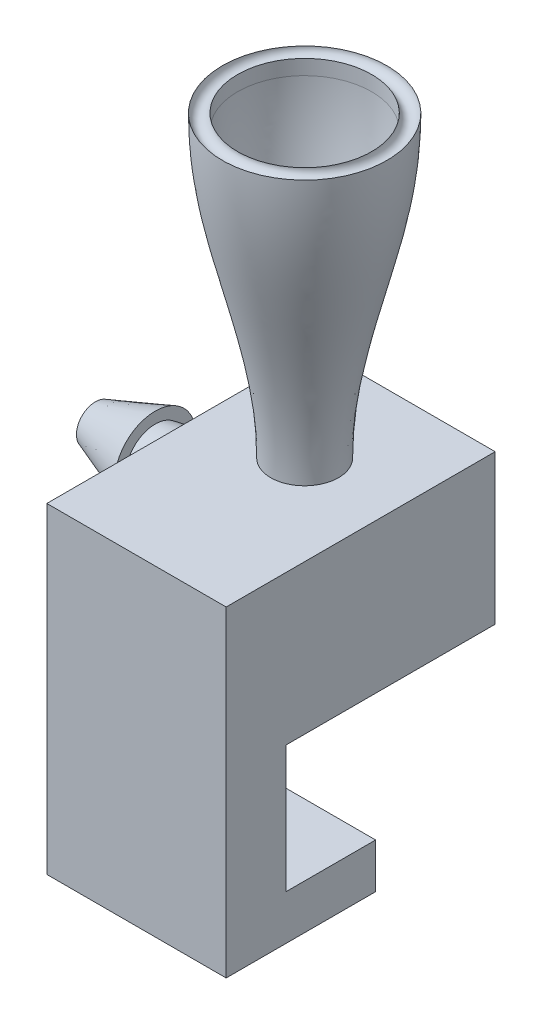
ISO-10303-21;
HEADER;
FILE_DESCRIPTION(('STEP AP214'),'2;1');
FILE_NAME('part.step','',(''),(''),'','','');
FILE_SCHEMA(('AUTOMOTIVE_DESIGN { 1 0 10303 214 1 1 1 1 }'));
ENDSEC;
DATA;
#1=APPLICATION_CONTEXT('core data for automotive mechanical design processes');
#2=APPLICATION_PROTOCOL_DEFINITION('international standard','automotive_design',2000,#1);
#3=PRODUCT_CONTEXT('',#1,'mechanical');
#4=PRODUCT('Part','Part','',(#3));
#5=PRODUCT_RELATED_PRODUCT_CATEGORY('part','',(#4));
#6=PRODUCT_DEFINITION_FORMATION('','',#4);
#7=PRODUCT_DEFINITION_CONTEXT('part definition',#1,'design');
#8=PRODUCT_DEFINITION('design','',#6,#7);
#9=PRODUCT_DEFINITION_SHAPE('','',#8);
#10=(LENGTH_UNIT() NAMED_UNIT(*) SI_UNIT(.MILLI.,.METRE.));
#11=(NAMED_UNIT(*) PLANE_ANGLE_UNIT() SI_UNIT($,.RADIAN.));
#12=(NAMED_UNIT(*) SI_UNIT($,.STERADIAN.) SOLID_ANGLE_UNIT());
#13=UNCERTAINTY_MEASURE_WITH_UNIT(LENGTH_MEASURE(1.E-05),#10,'distance_accuracy_value','');
#14=(GEOMETRIC_REPRESENTATION_CONTEXT(3) GLOBAL_UNCERTAINTY_ASSIGNED_CONTEXT((#13)) GLOBAL_UNIT_ASSIGNED_CONTEXT((#10,
#11,#12)) REPRESENTATION_CONTEXT('',''));
#15=CARTESIAN_POINT('',(0.,0.,0.));
#16=DIRECTION('',(0.,0.,1.));
#17=DIRECTION('',(1.,0.,0.));
#18=AXIS2_PLACEMENT_3D('',#15,#16,#17);
#19=CARTESIAN_POINT('',(0.,0.,14.));
#20=DIRECTION('',(0.,0.,-1.));
#21=DIRECTION('',(-1.,0.,0.));
#22=AXIS2_PLACEMENT_3D('',#19,#20,#21);
#23=PLANE('',#22);
#24=DIRECTION('',(0.,-1.,0.));
#25=VECTOR('',#24,1.);
#26=CARTESIAN_POINT('',(-2.,-13.5,14.));
#27=LINE('',#26,#25);
#28=CARTESIAN_POINT('',(-2.,-6.5,14.));
#29=VERTEX_POINT('',#28);
#30=CARTESIAN_POINT('',(-2.,-12.,14.));
#31=VERTEX_POINT('',#30);
#32=EDGE_CURVE('E142',#29,#31,#27,.T.);
#33=ORIENTED_EDGE('',*,*,#32,.F.);
#34=CARTESIAN_POINT('',(-0.499999999999999,-6.5,14.));
#35=DIRECTION('',(0.,0.,-1.));
#36=DIRECTION('',(-1.,0.,0.));
#37=AXIS2_PLACEMENT_3D('',#34,#35,#36);
#38=CIRCLE('',#37,1.5);
#39=CARTESIAN_POINT('',(-0.499999999999999,-5.00000000000001,14.));
#40=VERTEX_POINT('',#39);
#41=EDGE_CURVE('E185',#29,#40,#38,.T.);
#42=ORIENTED_EDGE('',*,*,#41,.T.);
#43=DIRECTION('',(-1.,0.,0.));
#44=VECTOR('',#43,1.);
#45=CARTESIAN_POINT('',(6.00000000000001,-5.,14.));
#46=LINE('',#45,#44);
#47=CARTESIAN_POINT('',(6.00000000000001,-5.,14.));
#48=VERTEX_POINT('',#47);
#49=EDGE_CURVE('E201',#48,#40,#46,.T.);
#50=ORIENTED_EDGE('',*,*,#49,.F.);
#51=DIRECTION('',(0.,1.,0.));
#52=VECTOR('',#51,1.);
#53=CARTESIAN_POINT('',(6.00000000000001,-5.,14.));
#54=LINE('',#53,#52);
#55=CARTESIAN_POINT('',(6.00000000000001,-13.5,14.));
#56=VERTEX_POINT('',#55);
#57=EDGE_CURVE('E204',#56,#48,#54,.T.);
#58=ORIENTED_EDGE('',*,*,#57,.F.);
#59=DIRECTION('',(1.,0.,0.));
#60=VECTOR('',#59,1.);
#61=CARTESIAN_POINT('',(-6.,-13.5,14.));
#62=LINE('',#61,#60);
#63=CARTESIAN_POINT('',(-0.499999999999999,-13.5,14.));
#64=VERTEX_POINT('',#63);
#65=EDGE_CURVE('E131',#64,#56,#62,.T.);
#66=ORIENTED_EDGE('',*,*,#65,.F.);
#67=CARTESIAN_POINT('',(-0.499999999999998,-12.,14.));
#68=DIRECTION('',(0.,0.,-1.));
#69=DIRECTION('',(-1.,0.,0.));
#70=AXIS2_PLACEMENT_3D('',#67,#68,#69);
#71=CIRCLE('',#70,1.5);
#72=EDGE_CURVE('E183',#64,#31,#71,.T.);
#73=ORIENTED_EDGE('',*,*,#72,.T.);
#74=EDGE_LOOP('',(#33,#42,#50,#58,#66,#73));
#75=FACE_BOUND('',#74,.T.);
#76=ADVANCED_FACE('F39',(#75),#23,.T.);
#77=CARTESIAN_POINT('',(6.00000000000001,-5.,18.));
#78=DIRECTION('',(0.,1.,0.));
#79=DIRECTION('',(0.,0.,1.));
#80=AXIS2_PLACEMENT_3D('',#77,#78,#79);
#81=PLANE('',#80);
#82=CARTESIAN_POINT('',(0.,-5.,6.75));
#83=DIRECTION('',(0.,-1.,0.));
#84=DIRECTION('',(0.,0.,-1.));
#85=AXIS2_PLACEMENT_3D('',#82,#83,#84);
#86=CIRCLE('',#85,0.5);
#87=CARTESIAN_POINT('',(0.,-5.,6.25));
#88=VERTEX_POINT('',#87);
#89=EDGE_CURVE('E380',#88,#88,#86,.T.);
#90=ORIENTED_EDGE('',*,*,#89,.F.);
#91=EDGE_LOOP('',(#90));
#92=FACE_BOUND('',#91,.T.);
#93=ORIENTED_EDGE('',*,*,#49,.T.);
#94=DIRECTION('',(0.,0.,-1.));
#95=VECTOR('',#94,1.);
#96=CARTESIAN_POINT('',(-0.499999999999999,-5.,8.));
#97=LINE('',#96,#95);
#98=CARTESIAN_POINT('',(-0.499999999999999,-5.,8.));
#99=VERTEX_POINT('',#98);
#100=EDGE_CURVE('E141',#40,#99,#97,.T.);
#101=ORIENTED_EDGE('',*,*,#100,.T.);
#102=DIRECTION('',(1.,0.,0.));
#103=VECTOR('',#102,1.);
#104=CARTESIAN_POINT('',(-6.,-5.,8.));
#105=LINE('',#104,#103);
#106=CARTESIAN_POINT('',(-6.,-5.,8.));
#107=VERTEX_POINT('',#106);
#108=EDGE_CURVE('E122',#107,#99,#105,.T.);
#109=ORIENTED_EDGE('',*,*,#108,.F.);
#110=DIRECTION('',(0.,0.,-1.));
#111=VECTOR('',#110,1.);
#112=CARTESIAN_POINT('',(-6.,-5.,18.));
#113=LINE('',#112,#111);
#114=CARTESIAN_POINT('',(-6.,-5.,0.));
#115=VERTEX_POINT('',#114);
#116=EDGE_CURVE('E138',#107,#115,#113,.T.);
#117=ORIENTED_EDGE('',*,*,#116,.T.);
#118=DIRECTION('',(1.,0.,0.));
#119=VECTOR('',#118,1.);
#120=CARTESIAN_POINT('',(6.00000000000001,-5.,0.));
#121=LINE('',#120,#119);
#122=CARTESIAN_POINT('',(6.00000000000001,-5.,0.));
#123=VERTEX_POINT('',#122);
#124=EDGE_CURVE('E356',#115,#123,#121,.T.);
#125=ORIENTED_EDGE('',*,*,#124,.T.);
#126=DIRECTION('',(0.,0.,-1.));
#127=VECTOR('',#126,1.);
#128=CARTESIAN_POINT('',(6.00000000000001,-5.,18.));
#129=LINE('',#128,#127);
#130=EDGE_CURVE('E152',#48,#123,#129,.T.);
#131=ORIENTED_EDGE('',*,*,#130,.F.);
#132=EDGE_LOOP('',(#93,#101,#109,#117,#125,#131));
#133=FACE_BOUND('',#132,.T.);
#134=ADVANCED_FACE('F136',(#92,#133),#81,.F.);
#135=CARTESIAN_POINT('',(-6.,-13.5,8.));
#136=DIRECTION('',(0.,-1.,0.));
#137=DIRECTION('',(1.,0.,0.));
#138=AXIS2_PLACEMENT_3D('',#135,#136,#137);
#139=PLANE('',#138);
#140=DIRECTION('',(1.,0.,0.));
#141=VECTOR('',#140,1.);
#142=CARTESIAN_POINT('',(-6.,-13.5,8.));
#143=LINE('',#142,#141);
#144=CARTESIAN_POINT('',(-0.499999999999999,-13.5,8.));
#145=VERTEX_POINT('',#144);
#146=CARTESIAN_POINT('',(6.00000000000001,-13.5,8.));
#147=VERTEX_POINT('',#146);
#148=EDGE_CURVE('E130',#145,#147,#143,.T.);
#149=ORIENTED_EDGE('',*,*,#148,.F.);
#150=DIRECTION('',(0.,0.,-1.));
#151=VECTOR('',#150,1.);
#152=CARTESIAN_POINT('',(-0.499999999999999,-13.5,14.));
#153=LINE('',#152,#151);
#154=EDGE_CURVE('E59',#145,#64,#153,.F.);
#155=ORIENTED_EDGE('',*,*,#154,.T.);
#156=ORIENTED_EDGE('',*,*,#65,.T.);
#157=DIRECTION('',(0.,0.,1.));
#158=VECTOR('',#157,1.);
#159=CARTESIAN_POINT('',(6.00000000000001,-13.5,8.));
#160=LINE('',#159,#158);
#161=EDGE_CURVE('E214',#147,#56,#160,.T.);
#162=ORIENTED_EDGE('',*,*,#161,.F.);
#163=EDGE_LOOP('',(#149,#155,#156,#162));
#164=FACE_BOUND('',#163,.T.);
#165=ADVANCED_FACE('F259',(#164),#139,.F.);
#166=CARTESIAN_POINT('',(-14.,0.,6.75));
#167=DIRECTION('',(1.,0.,0.));
#168=DIRECTION('',(0.,0.,1.));
#169=AXIS2_PLACEMENT_3D('',#166,#167,#168);
#170=CONICAL_SURFACE('',#169,1.27,0.174532925199433);
#171=CARTESIAN_POINT('',(-6.,0.,6.75));
#172=DIRECTION('',(1.,0.,0.));
#173=DIRECTION('',(0.,0.,-1.));
#174=AXIS2_PLACEMENT_3D('',#171,#172,#173);
#175=CIRCLE('',#174,2.68061584566772);
#176=CARTESIAN_POINT('',(-6.,0.,4.06938415433228));
#177=VERTEX_POINT('',#176);
#178=EDGE_CURVE('E162',#177,#177,#175,.F.);
#179=ORIENTED_EDGE('',*,*,#178,.T.);
#180=EDGE_LOOP('',(#179));
#181=FACE_BOUND('',#180,.T.);
#182=CARTESIAN_POINT('',(-10.,0.,6.75));
#183=DIRECTION('',(-1.,0.,0.));
#184=DIRECTION('',(0.,0.,1.));
#185=AXIS2_PLACEMENT_3D('',#182,#183,#184);
#186=CIRCLE('',#185,1.97530792283386);
#187=CARTESIAN_POINT('',(-10.,0.,8.72530792283386));
#188=VERTEX_POINT('',#187);
#189=EDGE_CURVE('E163',#188,#188,#186,.F.);
#190=ORIENTED_EDGE('',*,*,#189,.T.);
#191=EDGE_LOOP('',(#190));
#192=FACE_BOUND('',#191,.T.);
#193=ADVANCED_FACE('F267',(#181,#192),#170,.T.);
#194=CARTESIAN_POINT('',(6.00000000000001,4.99999999999999,18.));
#195=DIRECTION('',(0.,-1.,0.));
#196=DIRECTION('',(0.,0.,-1.));
#197=AXIS2_PLACEMENT_3D('',#194,#195,#196);
#198=PLANE('',#197);
#199=DIRECTION('',(-1.,0.,0.));
#200=VECTOR('',#199,1.);
#201=CARTESIAN_POINT('',(6.00000000000001,4.99999999999999,0.));
#202=LINE('',#201,#200);
#203=CARTESIAN_POINT('',(6.00000000000001,4.99999999999999,0.));
#204=VERTEX_POINT('',#203);
#205=CARTESIAN_POINT('',(-6.,4.99999999999999,0.));
#206=VERTEX_POINT('',#205);
#207=EDGE_CURVE('E361',#204,#206,#202,.T.);
#208=ORIENTED_EDGE('',*,*,#207,.T.);
#209=DIRECTION('',(0.,0.,-1.));
#210=VECTOR('',#209,1.);
#211=CARTESIAN_POINT('',(-6.,4.99999999999999,18.));
#212=LINE('',#211,#210);
#213=CARTESIAN_POINT('',(-6.,4.99999999999999,18.));
#214=VERTEX_POINT('',#213);
#215=EDGE_CURVE('E151',#214,#206,#212,.T.);
#216=ORIENTED_EDGE('',*,*,#215,.F.);
#217=DIRECTION('',(-1.,0.,0.));
#218=VECTOR('',#217,1.);
#219=CARTESIAN_POINT('',(6.00000000000001,4.99999999999999,18.));
#220=LINE('',#219,#218);
#221=CARTESIAN_POINT('',(6.00000000000001,4.99999999999999,18.));
#222=VERTEX_POINT('',#221);
#223=EDGE_CURVE('E355',#222,#214,#220,.T.);
#224=ORIENTED_EDGE('',*,*,#223,.F.);
#225=DIRECTION('',(0.,0.,-1.));
#226=VECTOR('',#225,1.);
#227=CARTESIAN_POINT('',(6.00000000000001,4.99999999999999,18.));
#228=LINE('',#227,#226);
#229=EDGE_CURVE('E154',#222,#204,#228,.T.);
#230=ORIENTED_EDGE('',*,*,#229,.T.);
#231=EDGE_LOOP('',(#208,#216,#224,#230));
#232=FACE_BOUND('',#231,.T.);
#233=CARTESIAN_POINT('',(0.,4.99999999999999,6.75));
#234=DIRECTION('',(0.,1.,0.));
#235=DIRECTION('',(-1.,0.,0.));
#236=AXIS2_PLACEMENT_3D('',#233,#234,#235);
#237=CIRCLE('',#236,2.27);
#238=CARTESIAN_POINT('',(-2.26999999999999,4.99999999999999,6.75));
#239=VERTEX_POINT('',#238);
#240=EDGE_CURVE('E166',#239,#239,#237,.T.);
#241=ORIENTED_EDGE('',*,*,#240,.F.);
#242=EDGE_LOOP('',(#241));
#243=FACE_BOUND('',#242,.T.);
#244=ADVANCED_FACE('F264',(#232,#243),#198,.F.);
#245=CARTESIAN_POINT('',(6.00000000000001,-5.,18.));
#246=DIRECTION('',(-1.,0.,0.));
#247=DIRECTION('',(0.,0.,1.));
#248=AXIS2_PLACEMENT_3D('',#245,#246,#247);
#249=PLANE('',#248);
#250=DIRECTION('',(0.,1.,0.));
#251=VECTOR('',#250,1.);
#252=CARTESIAN_POINT('',(6.00000000000001,-5.,0.));
#253=LINE('',#252,#251);
#254=EDGE_CURVE('E351',#123,#204,#253,.T.);
#255=ORIENTED_EDGE('',*,*,#254,.T.);
#256=ORIENTED_EDGE('',*,*,#229,.F.);
#257=DIRECTION('',(0.,1.,0.));
#258=VECTOR('',#257,1.);
#259=CARTESIAN_POINT('',(6.00000000000001,-5.,18.));
#260=LINE('',#259,#258);
#261=CARTESIAN_POINT('',(6.00000000000001,-16.5,18.));
#262=VERTEX_POINT('',#261);
#263=EDGE_CURVE('E352',#262,#222,#260,.T.);
#264=ORIENTED_EDGE('',*,*,#263,.F.);
#265=DIRECTION('',(0.,0.,1.));
#266=VECTOR('',#265,1.);
#267=CARTESIAN_POINT('',(6.00000000000001,-16.5,14.));
#268=LINE('',#267,#266);
#269=CARTESIAN_POINT('',(6.00000000000001,-16.5,8.));
#270=VERTEX_POINT('',#269);
#271=EDGE_CURVE('E206',#270,#262,#268,.T.);
#272=ORIENTED_EDGE('',*,*,#271,.F.);
#273=DIRECTION('',(0.,-1.,0.));
#274=VECTOR('',#273,1.);
#275=CARTESIAN_POINT('',(6.00000000000001,-16.5,8.));
#276=LINE('',#275,#274);
#277=EDGE_CURVE('E376',#147,#270,#276,.T.);
#278=ORIENTED_EDGE('',*,*,#277,.F.);
#279=ORIENTED_EDGE('',*,*,#161,.T.);
#280=ORIENTED_EDGE('',*,*,#57,.T.);
#281=ORIENTED_EDGE('',*,*,#130,.T.);
#282=EDGE_LOOP('',(#255,#256,#264,#272,#278,#279,#280,#281));
#283=FACE_BOUND('',#282,.T.);
#284=ADVANCED_FACE('F263',(#283),#249,.F.);
#285=CARTESIAN_POINT('',(-6.,-5.,18.));
#286=DIRECTION('',(1.,0.,0.));
#287=DIRECTION('',(0.,0.,-1.));
#288=AXIS2_PLACEMENT_3D('',#285,#286,#287);
#289=PLANE('',#288);
#290=ORIENTED_EDGE('',*,*,#116,.F.);
#291=DIRECTION('',(0.,1.,0.));
#292=VECTOR('',#291,1.);
#293=CARTESIAN_POINT('',(-6.,-16.5,8.));
#294=LINE('',#293,#292);
#295=CARTESIAN_POINT('',(-6.,-16.5,8.));
#296=VERTEX_POINT('',#295);
#297=EDGE_CURVE('E119',#296,#107,#294,.T.);
#298=ORIENTED_EDGE('',*,*,#297,.F.);
#299=DIRECTION('',(0.,0.,1.));
#300=VECTOR('',#299,1.);
#301=CARTESIAN_POINT('',(-6.,-16.5,14.));
#302=LINE('',#301,#300);
#303=CARTESIAN_POINT('',(-6.,-16.5,18.));
#304=VERTEX_POINT('',#303);
#305=EDGE_CURVE('E203',#296,#304,#302,.T.);
#306=ORIENTED_EDGE('',*,*,#305,.T.);
#307=DIRECTION('',(0.,-1.,0.));
#308=VECTOR('',#307,1.);
#309=CARTESIAN_POINT('',(-6.,-5.,18.));
#310=LINE('',#309,#308);
#311=EDGE_CURVE('E156',#214,#304,#310,.T.);
#312=ORIENTED_EDGE('',*,*,#311,.F.);
#313=ORIENTED_EDGE('',*,*,#215,.T.);
#314=DIRECTION('',(0.,-1.,0.));
#315=VECTOR('',#314,1.);
#316=CARTESIAN_POINT('',(-6.,-5.,0.));
#317=LINE('',#316,#315);
#318=EDGE_CURVE('E149',#206,#115,#317,.T.);
#319=ORIENTED_EDGE('',*,*,#318,.T.);
#320=EDGE_LOOP('',(#290,#298,#306,#312,#313,#319));
#321=FACE_BOUND('',#320,.T.);
#322=ORIENTED_EDGE('',*,*,#178,.F.);
#323=EDGE_LOOP('',(#322));
#324=FACE_BOUND('',#323,.T.);
#325=ADVANCED_FACE('F145',(#321,#324),#289,.F.);
#326=CARTESIAN_POINT('',(0.,0.,18.));
#327=DIRECTION('',(0.,0.,1.));
#328=DIRECTION('',(1.,0.,0.));
#329=AXIS2_PLACEMENT_3D('',#326,#327,#328);
#330=PLANE('',#329);
#331=ORIENTED_EDGE('',*,*,#263,.T.);
#332=ORIENTED_EDGE('',*,*,#223,.T.);
#333=ORIENTED_EDGE('',*,*,#311,.T.);
#334=DIRECTION('',(1.,0.,0.));
#335=VECTOR('',#334,1.);
#336=CARTESIAN_POINT('',(6.00000000000001,-16.5,18.));
#337=LINE('',#336,#335);
#338=EDGE_CURVE('E208',#304,#262,#337,.T.);
#339=ORIENTED_EDGE('',*,*,#338,.T.);
#340=EDGE_LOOP('',(#331,#332,#333,#339));
#341=FACE_BOUND('',#340,.T.);
#342=ADVANCED_FACE('F250',(#341),#330,.T.);
#343=CARTESIAN_POINT('',(0.,0.,0.));
#344=DIRECTION('',(0.,0.,1.));
#345=DIRECTION('',(1.,0.,0.));
#346=AXIS2_PLACEMENT_3D('',#343,#344,#345);
#347=PLANE('',#346);
#348=ORIENTED_EDGE('',*,*,#254,.F.);
#349=ORIENTED_EDGE('',*,*,#124,.F.);
#350=ORIENTED_EDGE('',*,*,#318,.F.);
#351=ORIENTED_EDGE('',*,*,#207,.F.);
#352=EDGE_LOOP('',(#348,#349,#350,#351));
#353=FACE_BOUND('',#352,.T.);
#354=ADVANCED_FACE('F247',(#353),#347,.F.);
#355=CARTESIAN_POINT('',(5.5,24.9985033250758,6.75));
#356=CARTESIAN_POINT('',(5.5,24.8078640431632,6.75));
#357=CARTESIAN_POINT('',(5.45962499923714,21.0332475845834,6.75));
#358=CARTESIAN_POINT('',(3.84462500038638,14.9852651185079,6.75));
#359=CARTESIAN_POINT('',(2.27,8.51036310105695,6.75));
#360=CARTESIAN_POINT('',(2.27,4.99999999999999,6.75));
#361=B_SPLINE_CURVE_WITH_KNOTS('',3,(#355,#356,#357,#358,#359,#360),.UNSPECIFIED.,.F.,.F.,(4,1,
1,4),(0.,0.025,0.5,1.),.UNSPECIFIED.);
#362=CARTESIAN_POINT('',(0.,24.9985033250758,6.75));
#363=DIRECTION('',(0.,1.,0.));
#364=AXIS1_PLACEMENT('',#362,#363);
#365=SURFACE_OF_REVOLUTION('',#361,#364);
#366=ORIENTED_EDGE('',*,*,#240,.T.);
#367=EDGE_LOOP('',(#366));
#368=FACE_BOUND('',#367,.T.);
#369=CARTESIAN_POINT('',(0.,24.9985033250758,6.75));
#370=DIRECTION('',(0.,1.,0.));
#371=DIRECTION('',(-1.,0.,0.));
#372=AXIS2_PLACEMENT_3D('',#369,#370,#371);
#373=CIRCLE('',#372,5.5);
#374=CARTESIAN_POINT('',(-5.5,24.9985033250758,6.75));
#375=VERTEX_POINT('',#374);
#376=EDGE_CURVE('E344',#375,#375,#373,.T.);
#377=ORIENTED_EDGE('',*,*,#376,.F.);
#378=EDGE_LOOP('',(#377));
#379=FACE_BOUND('',#378,.T.);
#380=ADVANCED_FACE('F242',(#368,#379),#365,.F.);
#381=CARTESIAN_POINT('',(0.,24.9985033250758,6.75));
#382=DIRECTION('',(0.,1.,0.));
#383=DIRECTION('',(-1.,0.,0.));
#384=AXIS2_PLACEMENT_3D('',#381,#382,#383);
#385=TOROIDAL_SURFACE('',#384,4.99033051297665,0.509669487023354);
#386=ORIENTED_EDGE('',*,*,#376,.T.);
#387=EDGE_LOOP('',(#386));
#388=FACE_BOUND('',#387,.T.);
#389=CARTESIAN_POINT('',(0.,24.9985033250758,6.75));
#390=DIRECTION('',(0.,1.,0.));
#391=DIRECTION('',(-1.,0.,0.));
#392=AXIS2_PLACEMENT_3D('',#389,#390,#391);
#393=CIRCLE('',#392,4.48066102595329);
#394=CARTESIAN_POINT('',(-4.48066102595329,24.9985033250758,6.75));
#395=VERTEX_POINT('',#394);
#396=EDGE_CURVE('E338',#395,#395,#393,.T.);
#397=ORIENTED_EDGE('',*,*,#396,.F.);
#398=EDGE_LOOP('',(#397));
#399=FACE_BOUND('',#398,.T.);
#400=ADVANCED_FACE('F246',(#388,#399),#385,.F.);
#401=CARTESIAN_POINT('',(0.,24.9985033250758,6.75));
#402=DIRECTION('',(0.,1.,0.));
#403=DIRECTION('',(-1.,0.,0.));
#404=AXIS2_PLACEMENT_3D('',#401,#402,#403);
#405=CYLINDRICAL_SURFACE('',#404,4.48066102595329);
#406=ORIENTED_EDGE('',*,*,#396,.T.);
#407=EDGE_LOOP('',(#406));
#408=FACE_BOUND('',#407,.T.);
#409=CARTESIAN_POINT('',(0.,23.9985033250758,6.75));
#410=DIRECTION('',(0.,1.,0.));
#411=DIRECTION('',(-1.,0.,0.));
#412=AXIS2_PLACEMENT_3D('',#409,#410,#411);
#413=CIRCLE('',#412,4.48066102595329);
#414=CARTESIAN_POINT('',(-4.48066102595329,23.9985033250758,6.75));
#415=VERTEX_POINT('',#414);
#416=EDGE_CURVE('E341',#415,#415,#413,.T.);
#417=ORIENTED_EDGE('',*,*,#416,.F.);
#418=EDGE_LOOP('',(#417));
#419=FACE_BOUND('',#418,.T.);
#420=ADVANCED_FACE('F327',(#408,#419),#405,.F.);
#421=CARTESIAN_POINT('',(1.29050985707037,5.99999999999965,6.75));
#422=CARTESIAN_POINT('',(1.32340791479247,6.81045377661056,6.75));
#423=CARTESIAN_POINT('',(1.46912763828871,8.44240215168173,6.75));
#424=CARTESIAN_POINT('',(1.98949380050677,11.5632671814085,6.75));
#425=CARTESIAN_POINT('',(2.73355739472195,14.5460160443791,6.75));
#426=CARTESIAN_POINT('',(3.46337893561183,17.378771911562,6.75));
#427=CARTESIAN_POINT('',(3.94672161196294,19.4893977131808,6.75));
#428=CARTESIAN_POINT('',(4.25345984620466,21.30045793944,6.75));
#429=CARTESIAN_POINT('',(4.41566199589679,22.8081463400785,6.75));
#430=CARTESIAN_POINT('',(4.46539814984662,23.6048348872637,6.75));
#431=CARTESIAN_POINT('',(4.48066102595329,23.9985033250758,6.75));
#432=B_SPLINE_CURVE_WITH_KNOTS('',3,(#421,#422,#423,#424,#425,#426,#427,#428,#429,#430,#431),
.UNSPECIFIED.,.F.,.F.,(4,1,1,1,1,1,1,1,4),(0.0462515222987968,0.159747812184763,
0.273244102070729,0.500236681842662,0.613732971728628,0.727229261614595,0.840725551500561,
0.897473696443544,0.954221841386527),.UNSPECIFIED.);
#433=CARTESIAN_POINT('',(0.,24.9985033250758,6.75));
#434=DIRECTION('',(0.,1.,0.));
#435=AXIS1_PLACEMENT('',#433,#434);
#436=SURFACE_OF_REVOLUTION('',#432,#435);
#437=ORIENTED_EDGE('',*,*,#416,.T.);
#438=EDGE_LOOP('',(#437));
#439=FACE_BOUND('',#438,.T.);
#440=CARTESIAN_POINT('',(0.,5.99999999999965,6.75));
#441=DIRECTION('',(0.,1.,0.));
#442=DIRECTION('',(-1.,0.,0.));
#443=AXIS2_PLACEMENT_3D('',#440,#441,#442);
#444=CIRCLE('',#443,1.29050985707036);
#445=CARTESIAN_POINT('',(-1.29050985707036,5.99999999999965,6.75));
#446=VERTEX_POINT('',#445);
#447=EDGE_CURVE('E342',#446,#446,#444,.T.);
#448=ORIENTED_EDGE('',*,*,#447,.F.);
#449=EDGE_LOOP('',(#448));
#450=FACE_BOUND('',#449,.T.);
#451=ADVANCED_FACE('F324',(#439,#450),#436,.F.);
#452=CARTESIAN_POINT('',(0.,24.9985033250758,6.75));
#453=DIRECTION('',(0.,1.,0.));
#454=DIRECTION('',(-1.,0.,0.));
#455=AXIS2_PLACEMENT_3D('',#452,#453,#454);
#456=CYLINDRICAL_SURFACE('',#455,1.29050985707037);
#457=CARTESIAN_POINT('',(0.,5.45311051718514,6.75));
#458=DIRECTION('',(0.,1.,0.));
#459=DIRECTION('',(-1.,0.,0.));
#460=AXIS2_PLACEMENT_3D('',#457,#458,#459);
#461=CIRCLE('',#460,1.29050985707037);
#462=CARTESIAN_POINT('',(-1.29050985707036,5.45311051718514,6.75));
#463=VERTEX_POINT('',#462);
#464=EDGE_CURVE('E174',#463,#463,#461,.F.);
#465=ORIENTED_EDGE('',*,*,#464,.T.);
#466=EDGE_LOOP('',(#465));
#467=FACE_BOUND('',#466,.T.);
#468=ORIENTED_EDGE('',*,*,#447,.T.);
#469=EDGE_LOOP('',(#468));
#470=FACE_BOUND('',#469,.T.);
#471=ADVANCED_FACE('F317',(#467,#470),#456,.F.);
#472=CARTESIAN_POINT('',(-14.,0.,6.75));
#473=DIRECTION('',(1.,0.,0.));
#474=DIRECTION('',(0.,0.,1.));
#475=AXIS2_PLACEMENT_3D('',#472,#473,#474);
#476=CONICAL_SURFACE('',#475,1.27,0.349065850398867);
#477=CARTESIAN_POINT('',(-10.,0.,6.75));
#478=DIRECTION('',(-1.,0.,0.));
#479=DIRECTION('',(0.,0.,1.));
#480=AXIS2_PLACEMENT_3D('',#477,#478,#479);
#481=CIRCLE('',#480,2.72588093706481);
#482=CARTESIAN_POINT('',(-10.,0.,9.47588093706481));
#483=VERTEX_POINT('',#482);
#484=EDGE_CURVE('E167',#483,#483,#481,.T.);
#485=ORIENTED_EDGE('',*,*,#484,.T.);
#486=EDGE_LOOP('',(#485));
#487=FACE_BOUND('',#486,.T.);
#488=CARTESIAN_POINT('',(-14.,0.,6.75));
#489=DIRECTION('',(-1.,0.,0.));
#490=DIRECTION('',(0.,0.,1.));
#491=AXIS2_PLACEMENT_3D('',#488,#489,#490);
#492=CIRCLE('',#491,1.27);
#493=CARTESIAN_POINT('',(-14.,0.,8.02));
#494=VERTEX_POINT('',#493);
#495=EDGE_CURVE('E221',#494,#494,#492,.T.);
#496=ORIENTED_EDGE('',*,*,#495,.F.);
#497=EDGE_LOOP('',(#496));
#498=FACE_BOUND('',#497,.T.);
#499=ADVANCED_FACE('F313',(#487,#498),#476,.T.);
#500=CARTESIAN_POINT('',(-10.,0.,6.75));
#501=DIRECTION('',(-1.,0.,0.));
#502=DIRECTION('',(0.,0.,1.));
#503=AXIS2_PLACEMENT_3D('',#500,#501,#502);
#504=PLANE('',#503);
#505=ORIENTED_EDGE('',*,*,#189,.F.);
#506=EDGE_LOOP('',(#505));
#507=FACE_BOUND('',#506,.T.);
#508=ORIENTED_EDGE('',*,*,#484,.F.);
#509=EDGE_LOOP('',(#508));
#510=FACE_BOUND('',#509,.T.);
#511=ADVANCED_FACE('F309',(#507,#510),#504,.F.);
#512=CARTESIAN_POINT('',(-19.,0.,6.75));
#513=DIRECTION('',(1.,0.,0.));
#514=DIRECTION('',(0.,1.,0.));
#515=AXIS2_PLACEMENT_3D('',#512,#513,#514);
#516=CYLINDRICAL_SURFACE('',#515,1.27);
#517=CARTESIAN_POINT('',(-4.49999999999999,0.,6.75));
#518=DIRECTION('',(-1.,0.,0.));
#519=DIRECTION('',(0.,0.,1.));
#520=AXIS2_PLACEMENT_3D('',#517,#518,#519);
#521=CIRCLE('',#520,1.27);
#522=CARTESIAN_POINT('',(-4.49999999999999,0.,8.02));
#523=VERTEX_POINT('',#522);
#524=EDGE_CURVE('E216',#523,#523,#521,.T.);
#525=ORIENTED_EDGE('',*,*,#524,.F.);
#526=EDGE_LOOP('',(#525));
#527=FACE_BOUND('',#526,.T.);
#528=ORIENTED_EDGE('',*,*,#495,.T.);
#529=EDGE_LOOP('',(#528));
#530=FACE_BOUND('',#529,.T.);
#531=ADVANCED_FACE('F303',(#527,#530),#516,.F.);
#532=CARTESIAN_POINT('',(-4.49999999999999,4.49999999999999,6.75));
#533=DIRECTION('',(0.,0.,1.));
#534=DIRECTION('',(1.,0.,0.));
#535=AXIS2_PLACEMENT_3D('',#532,#533,#534);
#536=TOROIDAL_SURFACE('',#535,4.49999999999999,1.27);
#537=CARTESIAN_POINT('',(-0.392158033804963,0.502979622605831,6.4398192840862));
#538=CARTESIAN_POINT('',(-0.368464817685736,0.538148194565425,6.40985133978598));
#539=CARTESIAN_POINT('',(-0.34285841057355,0.575927851832551,6.38443620728829));
#540=CARTESIAN_POINT('',(-0.289355984619077,0.654099851514788,6.34077030007124));
#541=CARTESIAN_POINT('',(-0.261446666958987,0.694507035483681,6.3225652535627));
#542=CARTESIAN_POINT('',(-0.211869574098483,0.765358072272306,6.29649678242883));
#543=CARTESIAN_POINT('',(-0.190564513344355,0.795528418524824,6.28716754062958));
#544=CARTESIAN_POINT('',(-0.147244493708851,0.856183101292757,6.27161777839221));
#545=CARTESIAN_POINT('',(-0.125229137026026,0.886667607013523,6.26539903332726));
#546=CARTESIAN_POINT('',(-0.0806231148042429,0.947611564737165,6.256017882668));
#547=CARTESIAN_POINT('',(-0.0580334075623471,0.978070980845733,6.25285069019605));
#548=CARTESIAN_POINT('',(-0.0123239800137196,1.03875634923818,6.24962746141782));
#549=CARTESIAN_POINT('',(0.0107957643278145,1.06898229085162,6.24957156647519));
#550=CARTESIAN_POINT('',(0.0674819754911486,1.14179196305686,6.25344547680218));
#551=CARTESIAN_POINT('',(0.101280396947509,1.18412202414405,6.25909315819094));
#552=CARTESIAN_POINT('',(0.169193266045264,1.26670145638153,6.27817946325283));
#553=CARTESIAN_POINT('',(0.203306836589269,1.30695527431128,6.2916006133694));
#554=CARTESIAN_POINT('',(0.259486302159722,1.37115778279081,6.32184191410804));
#555=CARTESIAN_POINT('',(0.281806328000148,1.39609701746579,6.33607107333541));
#556=CARTESIAN_POINT('',(0.325330094970836,1.44367878382325,6.36933131313735));
#557=CARTESIAN_POINT('',(0.34653524963437,1.46632425924944,6.38835612678284));
#558=CARTESIAN_POINT('',(0.381905318775748,1.50332908647883,6.4264983545559));
#559=CARTESIAN_POINT('',(0.39654149156762,1.51837520807621,6.44450662572571));
#560=CARTESIAN_POINT('',(0.423821679091904,1.54602709870054,6.48365049955451));
#561=CARTESIAN_POINT('',(0.436468275476646,1.55863603513428,6.50478197931059));
#562=CARTESIAN_POINT('',(0.456913264631247,1.5787916325915,6.5458962893988));
#563=CARTESIAN_POINT('',(0.465174613970146,1.58684102622762,6.56540056564302));
#564=CARTESIAN_POINT('',(0.479316193810686,1.60052635550644,6.60606159038621));
#565=CARTESIAN_POINT('',(0.485197533479202,1.60616341545073,6.62721756364068));
#566=CARTESIAN_POINT('',(0.494185744753584,1.61474712986792,6.6707715346615));
#567=CARTESIAN_POINT('',(0.497277639825905,1.61767926345847,6.69317555911532));
#568=CARTESIAN_POINT('',(0.500377687155725,1.6206191820937,6.73838578988549));
#569=CARTESIAN_POINT('',(0.500386829067612,1.62062790563893,6.76119186478057));
#570=CARTESIAN_POINT('',(0.497465726766403,1.61785758316361,6.80433943668691));
#571=CARTESIAN_POINT('',(0.494802520648456,1.61533180069945,6.82471656537518));
#572=CARTESIAN_POINT('',(0.487115842166908,1.60799843802474,6.86458829136399));
#573=CARTESIAN_POINT('',(0.482092353608678,1.60319084215796,6.88408288260815));
#574=CARTESIAN_POINT('',(0.469822820130663,1.59135116586205,6.92227934336521));
#575=CARTESIAN_POINT('',(0.462519393003432,1.58426148649883,6.94094461184738));
#576=CARTESIAN_POINT('',(0.446137979360175,1.5681928634055,6.97659793736806));
#577=CARTESIAN_POINT('',(0.43705911701131,1.55921298706223,6.99358516036618));
#578=CARTESIAN_POINT('',(0.413066205361306,1.53519636648423,7.03306461949745));
#579=CARTESIAN_POINT('',(0.397377167763968,1.51926321616708,7.05454292848831));
#580=CARTESIAN_POINT('',(0.364117879411405,1.48482161639533,7.09362780947329));
#581=CARTESIAN_POINT('',(0.346543615495658,1.46630764692608,7.11122586814855));
#582=CARTESIAN_POINT('',(0.302478896358796,1.41894590828,7.14961463735789));
#583=CARTESIAN_POINT('',(0.275417532659241,1.38909008853738,7.1684982329213));
#584=CARTESIAN_POINT('',(0.220555363603488,1.32684995283232,7.1998397727183));
#585=CARTESIAN_POINT('',(0.192753356235166,1.29446133776698,7.21228650615628));
#586=CARTESIAN_POINT('',(0.123157201708611,1.21128716237039,7.23662079159517));
#587=CARTESIAN_POINT('',(0.0813888906857144,1.15947273791775,7.24505018197295));
#588=CARTESIAN_POINT('',(-0.000877524894584047,1.05414644705883,7.25170351365653));
#589=CARTESIAN_POINT('',(-0.0413714738703808,1.00062998291382,7.24989697160085));
#590=CARTESIAN_POINT('',(-0.122166243813358,0.891217706590394,7.2366415065921));
#591=CARTESIAN_POINT('',(-0.162395044421301,0.835312073166948,7.22481115109295));
#592=CARTESIAN_POINT('',(-0.220740766420125,0.752733732799762,7.19913159987047));
#593=CARTESIAN_POINT('',(-0.239827489606817,0.72546356613977,7.18927148613814));
#594=CARTESIAN_POINT('',(-0.277234490579296,0.671608409857524,7.16667647218658));
#595=CARTESIAN_POINT('',(-0.295555412236948,0.645022852156636,7.15394404702516));
#596=CARTESIAN_POINT('',(-0.32945058196627,0.595532404526354,7.12667921302934));
#597=CARTESIAN_POINT('',(-0.345116894165188,0.572524219850817,7.11245122292967));
#598=CARTESIAN_POINT('',(-0.375419493303848,0.527820645549546,7.08096590726284));
#599=CARTESIAN_POINT('',(-0.390053821414656,0.506127762908773,7.06370302703896));
#600=CARTESIAN_POINT('',(-0.417989841399421,0.464574181589928,7.02541971784329));
#601=CARTESIAN_POINT('',(-0.431269740225169,0.444743760293381,7.00434956451417));
#602=CARTESIAN_POINT('',(-0.45536426893699,0.408675241083159,6.9581222721159));
#603=CARTESIAN_POINT('',(-0.466191103815672,0.392419370803336,6.93298648322525));
#604=CARTESIAN_POINT('',(-0.479952031190366,0.371728676460728,6.89102496591271));
#605=CARTESIAN_POINT('',(-0.48423410677215,0.365283361062688,6.87563514766089));
#606=CARTESIAN_POINT('',(-0.491389648927812,0.354507198833864,6.84381482134363));
#607=CARTESIAN_POINT('',(-0.49426445091281,0.35017434742795,6.82738531666103));
#608=CARTESIAN_POINT('',(-0.49837442930447,0.343978504349669,6.79372645717868));
#609=CARTESIAN_POINT('',(-0.499597345437212,0.342133981143273,6.77649209322713));
#610=CARTESIAN_POINT('',(-0.500233236526982,0.341174970944332,6.74191463222317));
#611=CARTESIAN_POINT('',(-0.499646692918788,0.342059757776593,6.72457156531821));
#612=CARTESIAN_POINT('',(-0.496864905505673,0.346254238049672,6.69196005307043));
#613=CARTESIAN_POINT('',(-0.494822412903611,0.349333673417257,6.67664739552011));
#614=CARTESIAN_POINT('',(-0.489463769246659,0.35740794235724,6.64677199347016));
#615=CARTESIAN_POINT('',(-0.486146776569523,0.362404041604416,6.63220975173308));
#616=CARTESIAN_POINT('',(-0.476757115262758,0.376535135153273,6.59786989222143));
#617=CARTESIAN_POINT('',(-0.470113811676632,0.386524484369784,6.57860191820072));
#618=CARTESIAN_POINT('',(-0.455207634644151,0.408900082195023,6.54221444763068));
#619=CARTESIAN_POINT('',(-0.446941621267061,0.421290977175467,6.52509922368928));
#620=CARTESIAN_POINT('',(-0.431065410188607,0.4450381903152,6.49623807917573));
#621=CARTESIAN_POINT('',(-0.423669339291819,0.456084108209943,6.48411143835285));
#622=CARTESIAN_POINT('',(-0.408310526047507,0.478976646697224,6.46108273452317));
#623=CARTESIAN_POINT('',(-0.400348596115112,0.490822118173147,6.45017897159603));
#624=CARTESIAN_POINT('',(-0.392158033804963,0.502979622605831,6.4398192840862));
#625=B_SPLINE_CURVE_WITH_KNOTS('',3,(#537,#538,#539,#540,#541,#542,#543,#544,#545,#546,#547,
#548,#549,#550,#551,#552,#553,#554,#555,#556,#557,#558,#559,#560,#561,#562,#563,#564,#565,#566,
#567,#568,#569,#570,#571,#572,#573,#574,#575,#576,#577,#578,#579,#580,#581,#582,#583,#584,#585,
#586,#587,#588,#589,#590,#591,#592,#593,#594,#595,#596,#597,#598,#599,#600,#601,#602,#603,#604,
#605,#606,#607,#608,#609,#610,#611,#612,#613,#614,#615,#616,#617,#618,#619,#620,#621,#622,#623,
#624),.UNSPECIFIED.,.T.,.F.,(4,2,2,2,2,2,2,2,2,2,2,2,2,2,2,2,2,2,2,2,2,2,2,2,2,2,2,2,2,2,2,2,2,
2,2,2,2,2,2,2,2,2,2,4),(0.,0.155715516459557,0.312403384862293,0.426549888346933,
0.540761468912334,0.65479359614009,0.768830904480543,0.931725865216977,1.09425607653765,
1.20304851665094,1.31169951795733,1.39437944039424,1.47695117728852,1.54465168099205,
1.61232059748183,1.6803507029507,1.74835896873508,1.81018705565497,1.87201556680273,
1.93554629747994,1.99910844766687,2.09160368609943,2.18429988438385,2.31705719960762,
2.45004496016841,2.6502072044606,2.85096585938071,3.05972585627434,3.16377358245356,
3.26773199134215,3.36136415062266,3.45516950050325,3.55030252492746,3.64495128834313,
3.69644888056802,3.74789750973685,3.79972592958656,3.8515405608722,3.89859469729447,
3.94567995969248,4.01339043847796,4.08123325141734,4.13513879395142,4.18896844855809),.UNSPECIFIED.);
#626=CARTESIAN_POINT('',(-0.392158033804963,0.502979622605831,6.4398192840862));
#627=VERTEX_POINT('',#626);
#628=EDGE_CURVE('E382',#627,#627,#625,.T.);
#629=ORIENTED_EDGE('',*,*,#628,.T.);
#630=EDGE_LOOP('',(#629));
#631=FACE_BOUND('',#630,.T.);
#632=CARTESIAN_POINT('',(0.,4.49999999999999,6.75));
#633=DIRECTION('',(0.,-1.,0.));
#634=DIRECTION('',(0.,0.,1.));
#635=AXIS2_PLACEMENT_3D('',#632,#633,#634);
#636=CIRCLE('',#635,1.27);
#637=CARTESIAN_POINT('',(0.,4.49999999999999,8.02));
#638=VERTEX_POINT('',#637);
#639=EDGE_CURVE('E218',#638,#638,#636,.T.);
#640=ORIENTED_EDGE('',*,*,#639,.F.);
#641=EDGE_LOOP('',(#640));
#642=FACE_BOUND('',#641,.T.);
#643=ORIENTED_EDGE('',*,*,#524,.T.);
#644=EDGE_LOOP('',(#643));
#645=FACE_BOUND('',#644,.T.);
#646=ADVANCED_FACE('F278',(#631,#642,#645),#536,.F.);
#647=CARTESIAN_POINT('',(0.,4.49999999999999,6.75));
#648=DIRECTION('',(0.,1.,0.));
#649=DIRECTION('',(-1.,0.,0.));
#650=AXIS2_PLACEMENT_3D('',#647,#648,#649);
#651=CYLINDRICAL_SURFACE('',#650,1.27);
#652=CARTESIAN_POINT('',(0.,4.54758656467047,6.75));
#653=DIRECTION('',(0.,1.,0.));
#654=DIRECTION('',(0.,0.,1.));
#655=AXIS2_PLACEMENT_3D('',#652,#653,#654);
#656=CIRCLE('',#655,1.27);
#657=CARTESIAN_POINT('',(0.,4.54758656467047,8.02));
#658=VERTEX_POINT('',#657);
#659=EDGE_CURVE('E168',#658,#658,#656,.T.);
#660=ORIENTED_EDGE('',*,*,#659,.T.);
#661=EDGE_LOOP('',(#660));
#662=FACE_BOUND('',#661,.T.);
#663=ORIENTED_EDGE('',*,*,#639,.T.);
#664=EDGE_LOOP('',(#663));
#665=FACE_BOUND('',#664,.T.);
#666=ADVANCED_FACE('F276',(#662,#665),#651,.F.);
#667=CARTESIAN_POINT('',(0.,4.54758656467051,6.75));
#668=DIRECTION('',(0.,1.,0.));
#669=DIRECTION('',(0.,0.,1.));
#670=AXIS2_PLACEMENT_3D('',#667,#668,#669);
#671=TOROIDAL_SURFACE('',#670,6.27,5.);
#672=CARTESIAN_POINT('',(0.,4.77396755279916,6.75));
#673=DIRECTION('',(0.,-1.,0.));
#674=DIRECTION('',(1.,0.,0.));
#675=AXIS2_PLACEMENT_3D('',#672,#673,#674);
#676=CIRCLE('',#675,1.27512746426759);
#677=CARTESIAN_POINT('',(1.2751274642676,4.77396755279916,6.75));
#678=VERTEX_POINT('',#677);
#679=EDGE_CURVE('E171',#678,#678,#676,.F.);
#680=ORIENTED_EDGE('',*,*,#679,.T.);
#681=EDGE_LOOP('',(#680));
#682=FACE_BOUND('',#681,.T.);
#683=ORIENTED_EDGE('',*,*,#659,.F.);
#684=EDGE_LOOP('',(#683));
#685=FACE_BOUND('',#684,.T.);
#686=ADVANCED_FACE('F272',(#682,#685),#671,.T.);
#687=CARTESIAN_POINT('',(0.,5.45311051718514,6.75));
#688=DIRECTION('',(0.,1.,0.));
#689=DIRECTION('',(-1.,0.,0.));
#690=AXIS2_PLACEMENT_3D('',#687,#688,#689);
#691=DEGENERATE_TOROIDAL_SURFACE('',#690,13.7094901429296,15.,.F.);
#692=ORIENTED_EDGE('',*,*,#464,.F.);
#693=EDGE_LOOP('',(#692));
#694=FACE_BOUND('',#693,.T.);
#695=ORIENTED_EDGE('',*,*,#679,.F.);
#696=EDGE_LOOP('',(#695));
#697=FACE_BOUND('',#696,.T.);
#698=ADVANCED_FACE('F275',(#694,#697),#691,.T.);
#699=CARTESIAN_POINT('',(6.00000000000001,-16.5,14.));
#700=DIRECTION('',(0.,-1.,0.));
#701=DIRECTION('',(0.,0.,-1.));
#702=AXIS2_PLACEMENT_3D('',#699,#700,#701);
#703=PLANE('',#702);
#704=CARTESIAN_POINT('',(0.,-16.5,15.8));
#705=DIRECTION('',(0.,-1.,0.));
#706=DIRECTION('',(0.,0.,-1.));
#707=AXIS2_PLACEMENT_3D('',#704,#705,#706);
#708=CIRCLE('',#707,1.375);
#709=CARTESIAN_POINT('',(0.,-16.5,14.425));
#710=VERTEX_POINT('',#709);
#711=EDGE_CURVE('E372',#710,#710,#708,.T.);
#712=ORIENTED_EDGE('',*,*,#711,.F.);
#713=EDGE_LOOP('',(#712));
#714=FACE_BOUND('',#713,.T.);
#715=ORIENTED_EDGE('',*,*,#338,.F.);
#716=ORIENTED_EDGE('',*,*,#305,.F.);
#717=DIRECTION('',(-1.,0.,0.));
#718=VECTOR('',#717,1.);
#719=CARTESIAN_POINT('',(-6.,-16.5,8.));
#720=LINE('',#719,#718);
#721=EDGE_CURVE('E126',#270,#296,#720,.T.);
#722=ORIENTED_EDGE('',*,*,#721,.F.);
#723=ORIENTED_EDGE('',*,*,#271,.T.);
#724=EDGE_LOOP('',(#715,#716,#722,#723));
#725=FACE_BOUND('',#724,.T.);
#726=ADVANCED_FACE('F280',(#714,#725),#703,.T.);
#727=CARTESIAN_POINT('',(0.,0.,8.));
#728=DIRECTION('',(0.,0.,-1.));
#729=DIRECTION('',(-1.,0.,0.));
#730=AXIS2_PLACEMENT_3D('',#727,#728,#729);
#731=PLANE('',#730);
#732=ORIENTED_EDGE('',*,*,#297,.T.);
#733=ORIENTED_EDGE('',*,*,#108,.T.);
#734=CARTESIAN_POINT('',(-0.499999999999999,-6.5,8.));
#735=DIRECTION('',(0.,0.,-1.));
#736=DIRECTION('',(-1.,0.,0.));
#737=AXIS2_PLACEMENT_3D('',#734,#735,#736);
#738=CIRCLE('',#737,1.5);
#739=CARTESIAN_POINT('',(-2.,-6.5,8.));
#740=VERTEX_POINT('',#739);
#741=EDGE_CURVE('E47',#99,#740,#738,.F.);
#742=ORIENTED_EDGE('',*,*,#741,.T.);
#743=DIRECTION('',(0.,1.,0.));
#744=VECTOR('',#743,1.);
#745=CARTESIAN_POINT('',(-2.,-13.5,8.));
#746=LINE('',#745,#744);
#747=CARTESIAN_POINT('',(-2.,-12.,8.));
#748=VERTEX_POINT('',#747);
#749=EDGE_CURVE('E143',#748,#740,#746,.T.);
#750=ORIENTED_EDGE('',*,*,#749,.F.);
#751=CARTESIAN_POINT('',(-0.499999999999998,-12.,8.));
#752=DIRECTION('',(0.,0.,-1.));
#753=DIRECTION('',(-1.,0.,0.));
#754=AXIS2_PLACEMENT_3D('',#751,#752,#753);
#755=CIRCLE('',#754,1.5);
#756=EDGE_CURVE('E11',#748,#145,#755,.F.);
#757=ORIENTED_EDGE('',*,*,#756,.T.);
#758=ORIENTED_EDGE('',*,*,#148,.T.);
#759=ORIENTED_EDGE('',*,*,#277,.T.);
#760=ORIENTED_EDGE('',*,*,#721,.T.);
#761=EDGE_LOOP('',(#732,#733,#742,#750,#757,#758,#759,#760));
#762=FACE_BOUND('',#761,.T.);
#763=ADVANCED_FACE('F121',(#762),#731,.T.);
#764=CARTESIAN_POINT('',(0.,-6.5,15.8));
#765=DIRECTION('',(0.,-1.,0.));
#766=DIRECTION('',(0.,0.,-1.));
#767=AXIS2_PLACEMENT_3D('',#764,#765,#766);
#768=CYLINDRICAL_SURFACE('',#767,1.375);
#769=CARTESIAN_POINT('',(0.,-6.5,15.8));
#770=DIRECTION('',(0.,-1.,0.));
#771=DIRECTION('',(0.,0.,-1.));
#772=AXIS2_PLACEMENT_3D('',#769,#770,#771);
#773=CIRCLE('',#772,1.375);
#774=CARTESIAN_POINT('',(0.,-6.5,14.425));
#775=VERTEX_POINT('',#774);
#776=EDGE_CURVE('E369',#775,#775,#773,.T.);
#777=ORIENTED_EDGE('',*,*,#776,.F.);
#778=EDGE_LOOP('',(#777));
#779=FACE_BOUND('',#778,.T.);
#780=ORIENTED_EDGE('',*,*,#711,.T.);
#781=EDGE_LOOP('',(#780));
#782=FACE_BOUND('',#781,.T.);
#783=ADVANCED_FACE('F399',(#779,#782),#768,.F.);
#784=CARTESIAN_POINT('',(0.,-6.5,15.8));
#785=DIRECTION('',(0.,-1.,0.));
#786=DIRECTION('',(0.,0.,-1.));
#787=AXIS2_PLACEMENT_3D('',#784,#785,#786);
#788=PLANE('',#787);
#789=ORIENTED_EDGE('',*,*,#776,.T.);
#790=EDGE_LOOP('',(#789));
#791=FACE_BOUND('',#790,.T.);
#792=ADVANCED_FACE('F395',(#791),#788,.T.);
#793=CARTESIAN_POINT('',(0.,24.9995033250758,6.75));
#794=DIRECTION('',(0.,-1.,0.));
#795=DIRECTION('',(0.,0.,-1.));
#796=AXIS2_PLACEMENT_3D('',#793,#794,#795);
#797=CYLINDRICAL_SURFACE('',#796,0.5);
#798=ORIENTED_EDGE('',*,*,#628,.F.);
#799=EDGE_LOOP('',(#798));
#800=FACE_BOUND('',#799,.T.);
#801=ORIENTED_EDGE('',*,*,#89,.T.);
#802=EDGE_LOOP('',(#801));
#803=FACE_BOUND('',#802,.T.);
#804=ADVANCED_FACE('F288',(#800,#803),#797,.F.);
#805=CARTESIAN_POINT('',(-2.,-13.5,18.002));
#806=DIRECTION('',(-1.,0.,0.));
#807=DIRECTION('',(0.,0.,1.));
#808=AXIS2_PLACEMENT_3D('',#805,#806,#807);
#809=PLANE('',#808);
#810=ORIENTED_EDGE('',*,*,#749,.T.);
#811=DIRECTION('',(0.,0.,-1.));
#812=VECTOR('',#811,1.);
#813=CARTESIAN_POINT('',(-2.,-6.5,14.));
#814=LINE('',#813,#812);
#815=EDGE_CURVE('E181',#740,#29,#814,.F.);
#816=ORIENTED_EDGE('',*,*,#815,.T.);
#817=ORIENTED_EDGE('',*,*,#32,.T.);
#818=DIRECTION('',(0.,0.,-1.));
#819=VECTOR('',#818,1.);
#820=CARTESIAN_POINT('',(-2.,-12.,8.));
#821=LINE('',#820,#819);
#822=EDGE_CURVE('E178',#31,#748,#821,.T.);
#823=ORIENTED_EDGE('',*,*,#822,.T.);
#824=EDGE_LOOP('',(#810,#816,#817,#823));
#825=FACE_BOUND('',#824,.T.);
#826=ADVANCED_FACE('F191',(#825),#809,.F.);
#827=CARTESIAN_POINT('',(-0.499999999999999,-6.5,18.));
#828=DIRECTION('',(0.,0.,1.));
#829=DIRECTION('',(1.,0.,0.));
#830=AXIS2_PLACEMENT_3D('',#827,#828,#829);
#831=CYLINDRICAL_SURFACE('',#830,1.5);
#832=ORIENTED_EDGE('',*,*,#41,.F.);
#833=ORIENTED_EDGE('',*,*,#815,.F.);
#834=ORIENTED_EDGE('',*,*,#741,.F.);
#835=ORIENTED_EDGE('',*,*,#100,.F.);
#836=EDGE_LOOP('',(#832,#833,#834,#835));
#837=FACE_BOUND('',#836,.T.);
#838=ADVANCED_FACE('F197',(#837),#831,.F.);
#839=CARTESIAN_POINT('',(-0.499999999999998,-12.,18.002));
#840=DIRECTION('',(0.,0.,1.));
#841=DIRECTION('',(1.,0.,0.));
#842=AXIS2_PLACEMENT_3D('',#839,#840,#841);
#843=CYLINDRICAL_SURFACE('',#842,1.5);
#844=ORIENTED_EDGE('',*,*,#72,.F.);
#845=ORIENTED_EDGE('',*,*,#154,.F.);
#846=ORIENTED_EDGE('',*,*,#756,.F.);
#847=ORIENTED_EDGE('',*,*,#822,.F.);
#848=EDGE_LOOP('',(#844,#845,#846,#847));
#849=FACE_BOUND('',#848,.T.);
#850=ADVANCED_FACE('F41',(#849),#843,.F.);
#851=CLOSED_SHELL('',(#76,#134,#165,#193,#244,#284,#325,#342,#354,#380,#400,#420,#451,#471,#499,
#511,#531,#646,#666,#686,#698,#726,#763,#783,#792,#804,#826,#838,#850));
#852=MANIFOLD_SOLID_BREP('B2',#851);
#853=ADVANCED_BREP_SHAPE_REPRESENTATION('',(#18,#852),#14);
#854=SHAPE_DEFINITION_REPRESENTATION(#9,#853);
ENDSEC;
END-ISO-10303-21;
